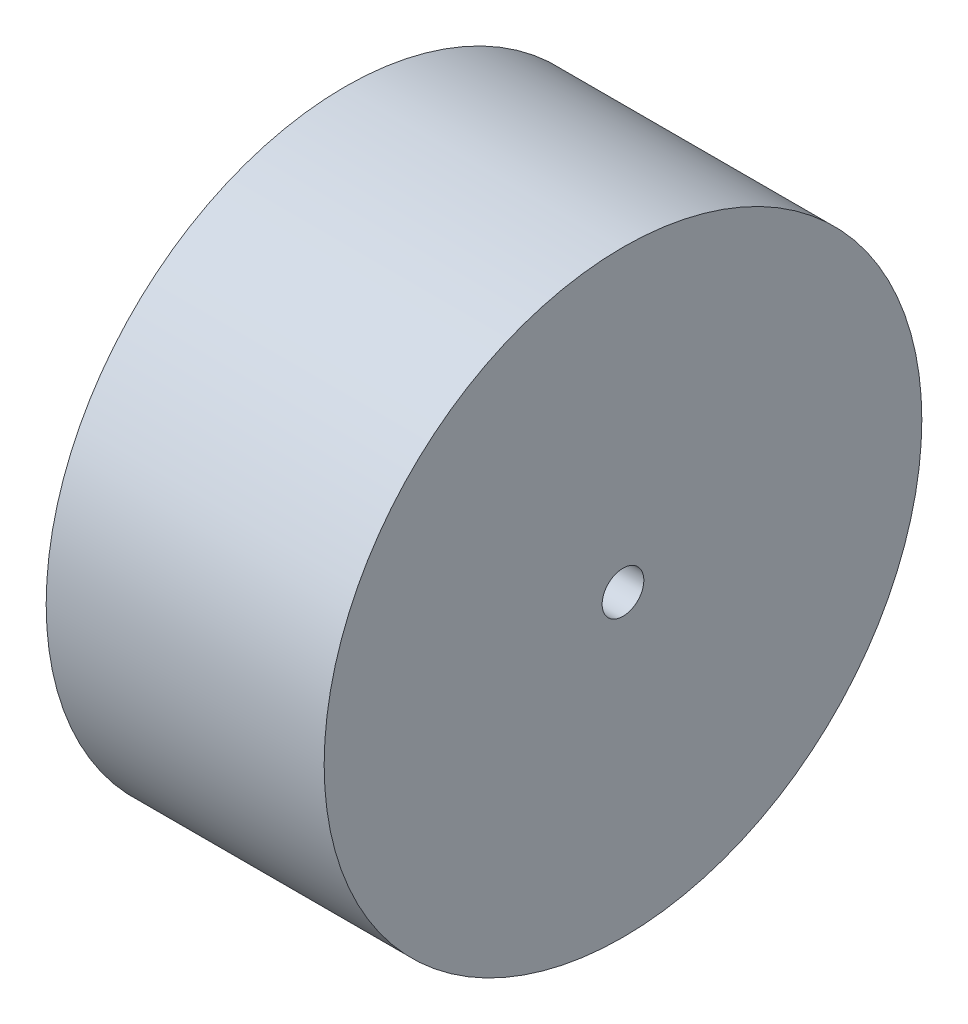
ISO-10303-21;
HEADER;
FILE_DESCRIPTION(('STEP AP214'),'2;1');
FILE_NAME('part.step','',(''),(''),'','','');
FILE_SCHEMA(('AUTOMOTIVE_DESIGN { 1 0 10303 214 1 1 1 1 }'));
ENDSEC;
DATA;
#1=APPLICATION_CONTEXT('core data for automotive mechanical design processes');
#2=APPLICATION_PROTOCOL_DEFINITION('international standard','automotive_design',2000,#1);
#3=PRODUCT_CONTEXT('',#1,'mechanical');
#4=PRODUCT('Part','Part','',(#3));
#5=PRODUCT_RELATED_PRODUCT_CATEGORY('part','',(#4));
#6=PRODUCT_DEFINITION_FORMATION('','',#4);
#7=PRODUCT_DEFINITION_CONTEXT('part definition',#1,'design');
#8=PRODUCT_DEFINITION('design','',#6,#7);
#9=PRODUCT_DEFINITION_SHAPE('','',#8);
#10=(LENGTH_UNIT() NAMED_UNIT(*) SI_UNIT(.MILLI.,.METRE.));
#11=(NAMED_UNIT(*) PLANE_ANGLE_UNIT() SI_UNIT($,.RADIAN.));
#12=(NAMED_UNIT(*) SI_UNIT($,.STERADIAN.) SOLID_ANGLE_UNIT());
#13=UNCERTAINTY_MEASURE_WITH_UNIT(LENGTH_MEASURE(1.E-05),#10,'distance_accuracy_value','');
#14=(GEOMETRIC_REPRESENTATION_CONTEXT(3) GLOBAL_UNCERTAINTY_ASSIGNED_CONTEXT((#13)) GLOBAL_UNIT_ASSIGNED_CONTEXT((#10,
#11,#12)) REPRESENTATION_CONTEXT('',''));
#15=CARTESIAN_POINT('',(0.,0.,0.));
#16=DIRECTION('',(0.,0.,1.));
#17=DIRECTION('',(1.,0.,0.));
#18=AXIS2_PLACEMENT_3D('',#15,#16,#17);
#19=CARTESIAN_POINT('',(20.,0.,0.));
#20=DIRECTION('',(-1.,0.,0.));
#21=DIRECTION('',(0.,0.,1.));
#22=AXIS2_PLACEMENT_3D('',#19,#20,#21);
#23=CYLINDRICAL_SURFACE('',#22,21.5);
#24=CARTESIAN_POINT('',(20.,0.,0.));
#25=DIRECTION('',(1.,0.,0.));
#26=DIRECTION('',(0.,0.,-1.));
#27=AXIS2_PLACEMENT_3D('',#24,#25,#26);
#28=CIRCLE('',#27,21.5);
#29=CARTESIAN_POINT('',(20.,0.,-21.5));
#30=VERTEX_POINT('',#29);
#31=EDGE_CURVE('E10',#30,#30,#28,.T.);
#32=ORIENTED_EDGE('',*,*,#31,.F.);
#33=EDGE_LOOP('',(#32));
#34=FACE_BOUND('',#33,.T.);
#35=CARTESIAN_POINT('',(0.,0.,0.));
#36=DIRECTION('',(1.,0.,0.));
#37=DIRECTION('',(0.,0.,-1.));
#38=AXIS2_PLACEMENT_3D('',#35,#36,#37);
#39=CIRCLE('',#38,21.5);
#40=CARTESIAN_POINT('',(0.,0.,-21.5));
#41=VERTEX_POINT('',#40);
#42=EDGE_CURVE('E40',#41,#41,#39,.T.);
#43=ORIENTED_EDGE('',*,*,#42,.T.);
#44=EDGE_LOOP('',(#43));
#45=FACE_BOUND('',#44,.T.);
#46=ADVANCED_FACE('F33',(#34,#45),#23,.T.);
#47=CARTESIAN_POINT('',(20.,0.,0.));
#48=DIRECTION('',(1.,0.,0.));
#49=DIRECTION('',(0.,0.,-1.));
#50=AXIS2_PLACEMENT_3D('',#47,#48,#49);
#51=PLANE('',#50);
#52=CARTESIAN_POINT('',(20.,0.,0.));
#53=DIRECTION('',(1.,0.,0.));
#54=DIRECTION('',(0.,0.,-1.));
#55=AXIS2_PLACEMENT_3D('',#52,#53,#54);
#56=CIRCLE('',#55,1.5);
#57=CARTESIAN_POINT('',(20.,0.,-1.5));
#58=VERTEX_POINT('',#57);
#59=EDGE_CURVE('E46',#58,#58,#56,.T.);
#60=ORIENTED_EDGE('',*,*,#59,.F.);
#61=EDGE_LOOP('',(#60));
#62=FACE_BOUND('',#61,.T.);
#63=ORIENTED_EDGE('',*,*,#31,.T.);
#64=EDGE_LOOP('',(#63));
#65=FACE_BOUND('',#64,.T.);
#66=ADVANCED_FACE('F62',(#62,#65),#51,.T.);
#67=CARTESIAN_POINT('',(0.,0.,0.));
#68=DIRECTION('',(1.,0.,0.));
#69=DIRECTION('',(0.,0.,-1.));
#70=AXIS2_PLACEMENT_3D('',#67,#68,#69);
#71=PLANE('',#70);
#72=CARTESIAN_POINT('',(0.,0.,0.));
#73=DIRECTION('',(1.,0.,0.));
#74=DIRECTION('',(0.,0.,-1.));
#75=AXIS2_PLACEMENT_3D('',#72,#73,#74);
#76=CIRCLE('',#75,1.5);
#77=CARTESIAN_POINT('',(0.,0.,-1.5));
#78=VERTEX_POINT('',#77);
#79=EDGE_CURVE('E36',#78,#78,#76,.T.);
#80=ORIENTED_EDGE('',*,*,#79,.T.);
#81=EDGE_LOOP('',(#80));
#82=FACE_BOUND('',#81,.T.);
#83=ORIENTED_EDGE('',*,*,#42,.F.);
#84=EDGE_LOOP('',(#83));
#85=FACE_BOUND('',#84,.T.);
#86=ADVANCED_FACE('F53',(#82,#85),#71,.F.);
#87=CARTESIAN_POINT('',(-10.,0.,0.));
#88=DIRECTION('',(1.,0.,0.));
#89=DIRECTION('',(0.,0.,-1.));
#90=AXIS2_PLACEMENT_3D('',#87,#88,#89);
#91=CYLINDRICAL_SURFACE('',#90,1.5);
#92=ORIENTED_EDGE('',*,*,#59,.T.);
#93=EDGE_LOOP('',(#92));
#94=FACE_BOUND('',#93,.T.);
#95=ORIENTED_EDGE('',*,*,#79,.F.);
#96=EDGE_LOOP('',(#95));
#97=FACE_BOUND('',#96,.T.);
#98=ADVANCED_FACE('F56',(#94,#97),#91,.F.);
#99=CLOSED_SHELL('',(#46,#66,#86,#98));
#100=MANIFOLD_SOLID_BREP('B2',#99);
#101=ADVANCED_BREP_SHAPE_REPRESENTATION('',(#18,#100),#14);
#102=SHAPE_DEFINITION_REPRESENTATION(#9,#101);
ENDSEC;
END-ISO-10303-21;
